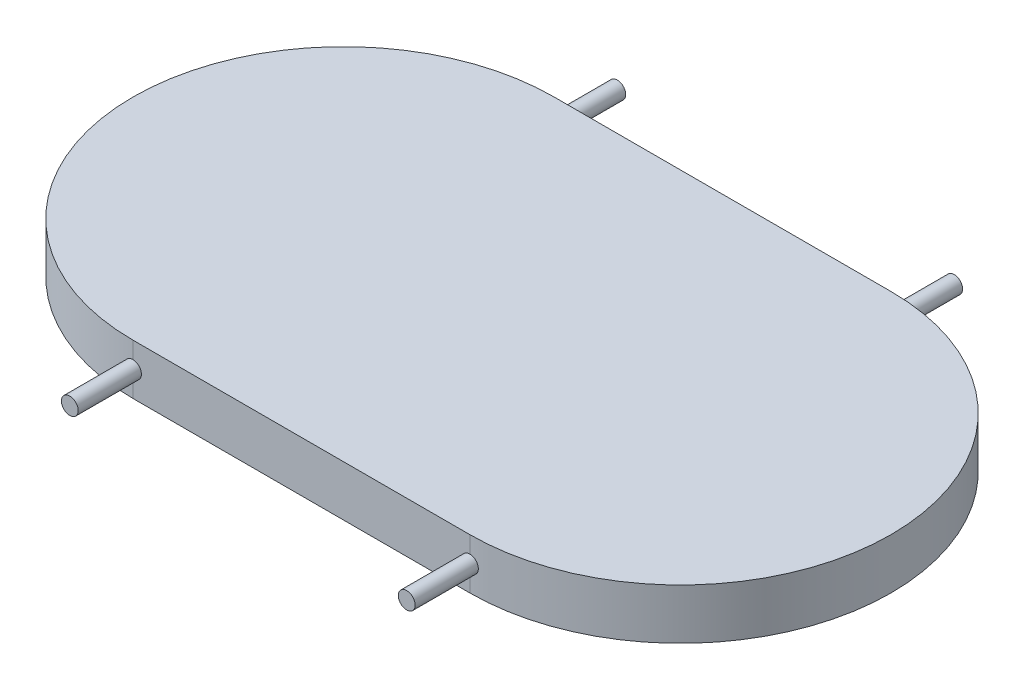
ISO-10303-21;
HEADER;
FILE_DESCRIPTION(('STEP AP214'),'2;1');
FILE_NAME('part.step','',(''),(''),'','','');
FILE_SCHEMA(('AUTOMOTIVE_DESIGN { 1 0 10303 214 1 1 1 1 }'));
ENDSEC;
DATA;
#1=APPLICATION_CONTEXT('core data for automotive mechanical design processes');
#2=APPLICATION_PROTOCOL_DEFINITION('international standard','automotive_design',2000,#1);
#3=PRODUCT_CONTEXT('',#1,'mechanical');
#4=PRODUCT('Part','Part','',(#3));
#5=PRODUCT_RELATED_PRODUCT_CATEGORY('part','',(#4));
#6=PRODUCT_DEFINITION_FORMATION('','',#4);
#7=PRODUCT_DEFINITION_CONTEXT('part definition',#1,'design');
#8=PRODUCT_DEFINITION('design','',#6,#7);
#9=PRODUCT_DEFINITION_SHAPE('','',#8);
#10=(LENGTH_UNIT() NAMED_UNIT(*) SI_UNIT(.MILLI.,.METRE.));
#11=(NAMED_UNIT(*) PLANE_ANGLE_UNIT() SI_UNIT($,.RADIAN.));
#12=(NAMED_UNIT(*) SI_UNIT($,.STERADIAN.) SOLID_ANGLE_UNIT());
#13=UNCERTAINTY_MEASURE_WITH_UNIT(LENGTH_MEASURE(1.E-05),#10,'distance_accuracy_value','');
#14=(GEOMETRIC_REPRESENTATION_CONTEXT(3) GLOBAL_UNCERTAINTY_ASSIGNED_CONTEXT((#13)) GLOBAL_UNIT_ASSIGNED_CONTEXT((#10,
#11,#12)) REPRESENTATION_CONTEXT('',''));
#15=CARTESIAN_POINT('',(0.,0.,0.));
#16=DIRECTION('',(0.,0.,1.));
#17=DIRECTION('',(1.,0.,0.));
#18=AXIS2_PLACEMENT_3D('',#15,#16,#17);
#19=CARTESIAN_POINT('',(-200.,60.,0.));
#20=DIRECTION('',(0.,-1.,0.));
#21=DIRECTION('',(0.,0.,-1.));
#22=AXIS2_PLACEMENT_3D('',#19,#20,#21);
#23=CYLINDRICAL_SURFACE('',#22,250.);
#24=CARTESIAN_POINT('',(-200.,0.,0.));
#25=DIRECTION('',(0.,1.,0.));
#26=DIRECTION('',(0.,0.,1.));
#27=AXIS2_PLACEMENT_3D('',#24,#25,#26);
#28=CIRCLE('',#27,250.);
#29=CARTESIAN_POINT('',(-200.,0.,-250.));
#30=VERTEX_POINT('',#29);
#31=CARTESIAN_POINT('',(-200.,0.,250.));
#32=VERTEX_POINT('',#31);
#33=EDGE_CURVE('E158',#30,#32,#28,.T.);
#34=ORIENTED_EDGE('',*,*,#33,.T.);
#35=DIRECTION('',(0.,-1.,0.));
#36=VECTOR('',#35,1.);
#37=CARTESIAN_POINT('',(-200.,60.,250.));
#38=LINE('',#37,#36);
#39=CARTESIAN_POINT('',(-200.,20.,250.));
#40=VERTEX_POINT('',#39);
#41=EDGE_CURVE('E197',#40,#32,#38,.T.);
#42=ORIENTED_EDGE('',*,*,#41,.F.);
#43=CARTESIAN_POINT('',(-200.,40.,250.));
#44=VERTEX_POINT('',#43);
#45=EDGE_CURVE('E201',#44,#40,#38,.T.);
#46=ORIENTED_EDGE('',*,*,#45,.F.);
#47=CARTESIAN_POINT('',(-200.,60.,250.));
#48=VERTEX_POINT('',#47);
#49=EDGE_CURVE('E199',#48,#44,#38,.T.);
#50=ORIENTED_EDGE('',*,*,#49,.F.);
#51=CARTESIAN_POINT('',(-200.,60.,0.));
#52=DIRECTION('',(0.,1.,0.));
#53=DIRECTION('',(0.,0.,1.));
#54=AXIS2_PLACEMENT_3D('',#51,#52,#53);
#55=CIRCLE('',#54,250.);
#56=CARTESIAN_POINT('',(-200.,60.,-250.));
#57=VERTEX_POINT('',#56);
#58=EDGE_CURVE('E162',#57,#48,#55,.T.);
#59=ORIENTED_EDGE('',*,*,#58,.F.);
#60=DIRECTION('',(0.,-1.,0.));
#61=VECTOR('',#60,1.);
#62=CARTESIAN_POINT('',(-200.,60.,-250.));
#63=LINE('',#62,#61);
#64=CARTESIAN_POINT('',(-200.,40.,-250.));
#65=VERTEX_POINT('',#64);
#66=EDGE_CURVE('E113',#57,#65,#63,.T.);
#67=ORIENTED_EDGE('',*,*,#66,.T.);
#68=CARTESIAN_POINT('',(-200.,20.,-250.));
#69=VERTEX_POINT('',#68);
#70=EDGE_CURVE('E108',#65,#69,#63,.T.);
#71=ORIENTED_EDGE('',*,*,#70,.T.);
#72=EDGE_CURVE('E110',#69,#30,#63,.T.);
#73=ORIENTED_EDGE('',*,*,#72,.T.);
#74=EDGE_LOOP('',(#34,#42,#46,#50,#59,#67,#71,#73));
#75=FACE_BOUND('',#74,.T.);
#76=ADVANCED_FACE('F45',(#75),#23,.T.);
#77=CARTESIAN_POINT('',(-200.,60.,250.));
#78=DIRECTION('',(0.,0.,-1.));
#79=DIRECTION('',(-1.,0.,0.));
#80=AXIS2_PLACEMENT_3D('',#77,#78,#79);
#81=PLANE('',#80);
#82=CARTESIAN_POINT('',(200.,30.,250.));
#83=DIRECTION('',(0.,0.,1.));
#84=DIRECTION('',(1.,0.,0.));
#85=AXIS2_PLACEMENT_3D('',#82,#83,#84);
#86=CIRCLE('',#85,10.);
#87=CARTESIAN_POINT('',(200.,40.,250.));
#88=VERTEX_POINT('',#87);
#89=CARTESIAN_POINT('',(200.,20.,250.));
#90=VERTEX_POINT('',#89);
#91=EDGE_CURVE('E146',#88,#90,#86,.T.);
#92=ORIENTED_EDGE('',*,*,#91,.F.);
#93=DIRECTION('',(0.,-1.,0.));
#94=VECTOR('',#93,1.);
#95=CARTESIAN_POINT('',(200.,60.,250.));
#96=LINE('',#95,#94);
#97=CARTESIAN_POINT('',(200.,60.,250.));
#98=VERTEX_POINT('',#97);
#99=EDGE_CURVE('E193',#98,#88,#96,.T.);
#100=ORIENTED_EDGE('',*,*,#99,.F.);
#101=DIRECTION('',(1.,0.,0.));
#102=VECTOR('',#101,1.);
#103=CARTESIAN_POINT('',(-200.,60.,250.));
#104=LINE('',#103,#102);
#105=EDGE_CURVE('E166',#48,#98,#104,.T.);
#106=ORIENTED_EDGE('',*,*,#105,.F.);
#107=ORIENTED_EDGE('',*,*,#49,.T.);
#108=CARTESIAN_POINT('',(-200.,30.,250.));
#109=DIRECTION('',(0.,0.,-1.));
#110=DIRECTION('',(-1.,0.,0.));
#111=AXIS2_PLACEMENT_3D('',#108,#109,#110);
#112=CIRCLE('',#111,10.);
#113=EDGE_CURVE('E53',#40,#44,#112,.F.);
#114=ORIENTED_EDGE('',*,*,#113,.F.);
#115=ORIENTED_EDGE('',*,*,#41,.T.);
#116=DIRECTION('',(1.,0.,0.));
#117=VECTOR('',#116,1.);
#118=CARTESIAN_POINT('',(-200.,0.,250.));
#119=LINE('',#118,#117);
#120=CARTESIAN_POINT('',(200.,0.,250.));
#121=VERTEX_POINT('',#120);
#122=EDGE_CURVE('E176',#32,#121,#119,.T.);
#123=ORIENTED_EDGE('',*,*,#122,.T.);
#124=EDGE_CURVE('E191',#90,#121,#96,.T.);
#125=ORIENTED_EDGE('',*,*,#124,.F.);
#126=EDGE_LOOP('',(#92,#100,#106,#107,#114,#115,#123,#125));
#127=FACE_BOUND('',#126,.T.);
#128=ADVANCED_FACE('F218',(#127),#81,.F.);
#129=CARTESIAN_POINT('',(200.,60.,0.));
#130=DIRECTION('',(0.,-1.,0.));
#131=DIRECTION('',(0.,0.,-1.));
#132=AXIS2_PLACEMENT_3D('',#129,#130,#131);
#133=CYLINDRICAL_SURFACE('',#132,250.);
#134=CARTESIAN_POINT('',(200.,0.,0.));
#135=DIRECTION('',(0.,1.,0.));
#136=DIRECTION('',(0.,0.,1.));
#137=AXIS2_PLACEMENT_3D('',#134,#135,#136);
#138=CIRCLE('',#137,250.);
#139=CARTESIAN_POINT('',(200.,0.,-250.));
#140=VERTEX_POINT('',#139);
#141=EDGE_CURVE('E180',#121,#140,#138,.T.);
#142=ORIENTED_EDGE('',*,*,#141,.T.);
#143=DIRECTION('',(0.,-1.,0.));
#144=VECTOR('',#143,1.);
#145=CARTESIAN_POINT('',(200.,60.,-250.));
#146=LINE('',#145,#144);
#147=CARTESIAN_POINT('',(200.,20.,-250.));
#148=VERTEX_POINT('',#147);
#149=EDGE_CURVE('E187',#148,#140,#146,.T.);
#150=ORIENTED_EDGE('',*,*,#149,.F.);
#151=CARTESIAN_POINT('',(200.,40.,-250.));
#152=VERTEX_POINT('',#151);
#153=EDGE_CURVE('E192',#152,#148,#146,.T.);
#154=ORIENTED_EDGE('',*,*,#153,.F.);
#155=CARTESIAN_POINT('',(200.,60.,-250.));
#156=VERTEX_POINT('',#155);
#157=EDGE_CURVE('E188',#156,#152,#146,.T.);
#158=ORIENTED_EDGE('',*,*,#157,.F.);
#159=CARTESIAN_POINT('',(200.,60.,0.));
#160=DIRECTION('',(0.,1.,0.));
#161=DIRECTION('',(0.,0.,1.));
#162=AXIS2_PLACEMENT_3D('',#159,#160,#161);
#163=CIRCLE('',#162,250.);
#164=EDGE_CURVE('E169',#98,#156,#163,.T.);
#165=ORIENTED_EDGE('',*,*,#164,.F.);
#166=ORIENTED_EDGE('',*,*,#99,.T.);
#167=EDGE_CURVE('E198',#88,#90,#96,.T.);
#168=ORIENTED_EDGE('',*,*,#167,.T.);
#169=ORIENTED_EDGE('',*,*,#124,.T.);
#170=EDGE_LOOP('',(#142,#150,#154,#158,#165,#166,#168,#169));
#171=FACE_BOUND('',#170,.T.);
#172=ADVANCED_FACE('F224',(#171),#133,.T.);
#173=CARTESIAN_POINT('',(-200.,60.,-250.));
#174=DIRECTION('',(0.,0.,1.));
#175=DIRECTION('',(1.,0.,0.));
#176=AXIS2_PLACEMENT_3D('',#173,#174,#175);
#177=PLANE('',#176);
#178=CARTESIAN_POINT('',(-200.,30.,-250.));
#179=DIRECTION('',(0.,0.,-1.));
#180=DIRECTION('',(-1.,0.,0.));
#181=AXIS2_PLACEMENT_3D('',#178,#179,#180);
#182=CIRCLE('',#181,10.);
#183=EDGE_CURVE('E60',#65,#69,#182,.T.);
#184=ORIENTED_EDGE('',*,*,#183,.F.);
#185=ORIENTED_EDGE('',*,*,#66,.F.);
#186=DIRECTION('',(-1.,0.,0.));
#187=VECTOR('',#186,1.);
#188=CARTESIAN_POINT('',(-200.,60.,-250.));
#189=LINE('',#188,#187);
#190=EDGE_CURVE('E124',#156,#57,#189,.T.);
#191=ORIENTED_EDGE('',*,*,#190,.F.);
#192=ORIENTED_EDGE('',*,*,#157,.T.);
#193=CARTESIAN_POINT('',(200.,30.,-250.));
#194=DIRECTION('',(0.,0.,1.));
#195=DIRECTION('',(1.,0.,0.));
#196=AXIS2_PLACEMENT_3D('',#193,#194,#195);
#197=CIRCLE('',#196,10.);
#198=EDGE_CURVE('E11',#148,#152,#197,.F.);
#199=ORIENTED_EDGE('',*,*,#198,.F.);
#200=ORIENTED_EDGE('',*,*,#149,.T.);
#201=DIRECTION('',(-1.,0.,0.));
#202=VECTOR('',#201,1.);
#203=CARTESIAN_POINT('',(-200.,0.,-250.));
#204=LINE('',#203,#202);
#205=EDGE_CURVE('E121',#140,#30,#204,.T.);
#206=ORIENTED_EDGE('',*,*,#205,.T.);
#207=ORIENTED_EDGE('',*,*,#72,.F.);
#208=EDGE_LOOP('',(#184,#185,#191,#192,#199,#200,#206,#207));
#209=FACE_BOUND('',#208,.T.);
#210=ADVANCED_FACE('F119',(#209),#177,.F.);
#211=CARTESIAN_POINT('',(-200.,60.,0.));
#212=DIRECTION('',(0.,1.,0.));
#213=DIRECTION('',(0.,0.,1.));
#214=AXIS2_PLACEMENT_3D('',#211,#212,#213);
#215=PLANE('',#214);
#216=ORIENTED_EDGE('',*,*,#58,.T.);
#217=ORIENTED_EDGE('',*,*,#105,.T.);
#218=ORIENTED_EDGE('',*,*,#164,.T.);
#219=ORIENTED_EDGE('',*,*,#190,.T.);
#220=EDGE_LOOP('',(#216,#217,#218,#219));
#221=FACE_BOUND('',#220,.T.);
#222=ADVANCED_FACE('F243',(#221),#215,.T.);
#223=CARTESIAN_POINT('',(-200.,0.,0.));
#224=DIRECTION('',(0.,1.,0.));
#225=DIRECTION('',(0.,0.,1.));
#226=AXIS2_PLACEMENT_3D('',#223,#224,#225);
#227=PLANE('',#226);
#228=ORIENTED_EDGE('',*,*,#33,.F.);
#229=ORIENTED_EDGE('',*,*,#205,.F.);
#230=ORIENTED_EDGE('',*,*,#141,.F.);
#231=ORIENTED_EDGE('',*,*,#122,.F.);
#232=EDGE_LOOP('',(#228,#229,#230,#231));
#233=FACE_BOUND('',#232,.T.);
#234=ADVANCED_FACE('F222',(#233),#227,.F.);
#235=CARTESIAN_POINT('',(-200.,30.,250.));
#236=DIRECTION('',(0.,0.,1.));
#237=DIRECTION('',(1.,0.,0.));
#238=AXIS2_PLACEMENT_3D('',#235,#236,#237);
#239=PLANE('',#238);
#240=CARTESIAN_POINT('',(-200.,30.,250.));
#241=DIRECTION('',(0.,0.,1.));
#242=DIRECTION('',(1.,0.,0.));
#243=AXIS2_PLACEMENT_3D('',#240,#241,#242);
#244=CIRCLE('',#243,10.);
#245=EDGE_CURVE('E149',#44,#40,#244,.T.);
#246=ORIENTED_EDGE('',*,*,#245,.F.);
#247=ORIENTED_EDGE('',*,*,#45,.T.);
#248=EDGE_LOOP('',(#246,#247));
#249=FACE_BOUND('',#248,.T.);
#250=ADVANCED_FACE('F211',(#249),#239,.F.);
#251=CARTESIAN_POINT('',(-200.,30.,325.));
#252=DIRECTION('',(0.,0.,-1.));
#253=DIRECTION('',(-1.,0.,0.));
#254=AXIS2_PLACEMENT_3D('',#251,#252,#253);
#255=CYLINDRICAL_SURFACE('',#254,10.);
#256=CARTESIAN_POINT('',(-200.,30.,325.));
#257=DIRECTION('',(0.,0.,1.));
#258=DIRECTION('',(1.,0.,0.));
#259=AXIS2_PLACEMENT_3D('',#256,#257,#258);
#260=CIRCLE('',#259,10.);
#261=CARTESIAN_POINT('',(-190.,30.,325.));
#262=VERTEX_POINT('',#261);
#263=EDGE_CURVE('E154',#262,#262,#260,.T.);
#264=ORIENTED_EDGE('',*,*,#263,.F.);
#265=EDGE_LOOP('',(#264));
#266=FACE_BOUND('',#265,.T.);
#267=ORIENTED_EDGE('',*,*,#245,.T.);
#268=ORIENTED_EDGE('',*,*,#113,.T.);
#269=EDGE_LOOP('',(#267,#268));
#270=FACE_BOUND('',#269,.T.);
#271=ADVANCED_FACE('F206',(#266,#270),#255,.T.);
#272=CARTESIAN_POINT('',(-200.,30.,325.));
#273=DIRECTION('',(0.,0.,1.));
#274=DIRECTION('',(1.,0.,0.));
#275=AXIS2_PLACEMENT_3D('',#272,#273,#274);
#276=PLANE('',#275);
#277=ORIENTED_EDGE('',*,*,#263,.T.);
#278=EDGE_LOOP('',(#277));
#279=FACE_BOUND('',#278,.T.);
#280=ADVANCED_FACE('F279',(#279),#276,.T.);
#281=CARTESIAN_POINT('',(200.,30.,325.));
#282=DIRECTION('',(0.,0.,-1.));
#283=DIRECTION('',(-1.,0.,0.));
#284=AXIS2_PLACEMENT_3D('',#281,#282,#283);
#285=CYLINDRICAL_SURFACE('',#284,10.);
#286=CARTESIAN_POINT('',(200.,30.,325.));
#287=DIRECTION('',(0.,0.,1.));
#288=DIRECTION('',(1.,0.,0.));
#289=AXIS2_PLACEMENT_3D('',#286,#287,#288);
#290=CIRCLE('',#289,10.);
#291=CARTESIAN_POINT('',(210.,30.,325.));
#292=VERTEX_POINT('',#291);
#293=EDGE_CURVE('E144',#292,#292,#290,.T.);
#294=ORIENTED_EDGE('',*,*,#293,.F.);
#295=EDGE_LOOP('',(#294));
#296=FACE_BOUND('',#295,.T.);
#297=ORIENTED_EDGE('',*,*,#91,.T.);
#298=EDGE_CURVE('E150',#90,#88,#86,.T.);
#299=ORIENTED_EDGE('',*,*,#298,.T.);
#300=EDGE_LOOP('',(#297,#299));
#301=FACE_BOUND('',#300,.T.);
#302=ADVANCED_FACE('F236',(#296,#301),#285,.T.);
#303=CARTESIAN_POINT('',(200.,30.,325.));
#304=DIRECTION('',(0.,0.,1.));
#305=DIRECTION('',(1.,0.,0.));
#306=AXIS2_PLACEMENT_3D('',#303,#304,#305);
#307=PLANE('',#306);
#308=ORIENTED_EDGE('',*,*,#293,.T.);
#309=EDGE_LOOP('',(#308));
#310=FACE_BOUND('',#309,.T.);
#311=ADVANCED_FACE('F259',(#310),#307,.T.);
#312=CARTESIAN_POINT('',(200.,30.,250.));
#313=DIRECTION('',(0.,0.,1.));
#314=DIRECTION('',(1.,0.,0.));
#315=AXIS2_PLACEMENT_3D('',#312,#313,#314);
#316=PLANE('',#315);
#317=ORIENTED_EDGE('',*,*,#167,.F.);
#318=ORIENTED_EDGE('',*,*,#298,.F.);
#319=EDGE_LOOP('',(#317,#318));
#320=FACE_BOUND('',#319,.T.);
#321=ADVANCED_FACE('F250',(#320),#316,.F.);
#322=CARTESIAN_POINT('',(200.,30.,-250.));
#323=DIRECTION('',(0.,0.,-1.));
#324=DIRECTION('',(-1.,0.,0.));
#325=AXIS2_PLACEMENT_3D('',#322,#323,#324);
#326=PLANE('',#325);
#327=CARTESIAN_POINT('',(200.,30.,-250.));
#328=DIRECTION('',(0.,0.,-1.));
#329=DIRECTION('',(-1.,0.,0.));
#330=AXIS2_PLACEMENT_3D('',#327,#328,#329);
#331=CIRCLE('',#330,10.);
#332=EDGE_CURVE('E133',#152,#148,#331,.T.);
#333=ORIENTED_EDGE('',*,*,#332,.F.);
#334=ORIENTED_EDGE('',*,*,#153,.T.);
#335=EDGE_LOOP('',(#333,#334));
#336=FACE_BOUND('',#335,.T.);
#337=ADVANCED_FACE('F248',(#336),#326,.F.);
#338=CARTESIAN_POINT('',(200.,30.,-325.));
#339=DIRECTION('',(0.,0.,1.));
#340=DIRECTION('',(1.,0.,0.));
#341=AXIS2_PLACEMENT_3D('',#338,#339,#340);
#342=CYLINDRICAL_SURFACE('',#341,10.);
#343=CARTESIAN_POINT('',(200.,30.,-325.));
#344=DIRECTION('',(0.,0.,-1.));
#345=DIRECTION('',(-1.,0.,0.));
#346=AXIS2_PLACEMENT_3D('',#343,#344,#345);
#347=CIRCLE('',#346,10.);
#348=CARTESIAN_POINT('',(190.,30.,-325.));
#349=VERTEX_POINT('',#348);
#350=EDGE_CURVE('E136',#349,#349,#347,.T.);
#351=ORIENTED_EDGE('',*,*,#350,.F.);
#352=EDGE_LOOP('',(#351));
#353=FACE_BOUND('',#352,.T.);
#354=ORIENTED_EDGE('',*,*,#332,.T.);
#355=ORIENTED_EDGE('',*,*,#198,.T.);
#356=EDGE_LOOP('',(#354,#355));
#357=FACE_BOUND('',#356,.T.);
#358=ADVANCED_FACE('F247',(#353,#357),#342,.T.);
#359=CARTESIAN_POINT('',(200.,30.,-325.));
#360=DIRECTION('',(0.,0.,-1.));
#361=DIRECTION('',(-1.,0.,0.));
#362=AXIS2_PLACEMENT_3D('',#359,#360,#361);
#363=PLANE('',#362);
#364=ORIENTED_EDGE('',*,*,#350,.T.);
#365=EDGE_LOOP('',(#364));
#366=FACE_BOUND('',#365,.T.);
#367=ADVANCED_FACE('F256',(#366),#363,.T.);
#368=CARTESIAN_POINT('',(-200.,30.,-325.));
#369=DIRECTION('',(0.,0.,1.));
#370=DIRECTION('',(1.,0.,0.));
#371=AXIS2_PLACEMENT_3D('',#368,#369,#370);
#372=CYLINDRICAL_SURFACE('',#371,10.);
#373=CARTESIAN_POINT('',(-200.,30.,-325.));
#374=DIRECTION('',(0.,0.,-1.));
#375=DIRECTION('',(-1.,0.,0.));
#376=AXIS2_PLACEMENT_3D('',#373,#374,#375);
#377=CIRCLE('',#376,10.);
#378=CARTESIAN_POINT('',(-210.,30.,-325.));
#379=VERTEX_POINT('',#378);
#380=EDGE_CURVE('E129',#379,#379,#377,.T.);
#381=ORIENTED_EDGE('',*,*,#380,.F.);
#382=EDGE_LOOP('',(#381));
#383=FACE_BOUND('',#382,.T.);
#384=ORIENTED_EDGE('',*,*,#183,.T.);
#385=EDGE_CURVE('E125',#69,#65,#182,.T.);
#386=ORIENTED_EDGE('',*,*,#385,.T.);
#387=EDGE_LOOP('',(#384,#386));
#388=FACE_BOUND('',#387,.T.);
#389=ADVANCED_FACE('F131',(#383,#388),#372,.T.);
#390=CARTESIAN_POINT('',(-200.,30.,-325.));
#391=DIRECTION('',(0.,0.,-1.));
#392=DIRECTION('',(-1.,0.,0.));
#393=AXIS2_PLACEMENT_3D('',#390,#391,#392);
#394=PLANE('',#393);
#395=ORIENTED_EDGE('',*,*,#380,.T.);
#396=EDGE_LOOP('',(#395));
#397=FACE_BOUND('',#396,.T.);
#398=ADVANCED_FACE('F333',(#397),#394,.T.);
#399=CARTESIAN_POINT('',(-200.,30.,-250.));
#400=DIRECTION('',(0.,0.,-1.));
#401=DIRECTION('',(-1.,0.,0.));
#402=AXIS2_PLACEMENT_3D('',#399,#400,#401);
#403=PLANE('',#402);
#404=ORIENTED_EDGE('',*,*,#70,.F.);
#405=ORIENTED_EDGE('',*,*,#385,.F.);
#406=EDGE_LOOP('',(#404,#405));
#407=FACE_BOUND('',#406,.T.);
#408=ADVANCED_FACE('F126',(#407),#403,.F.);
#409=CLOSED_SHELL('',(#76,#128,#172,#210,#222,#234,#250,#271,#280,#302,#311,#321,#337,#358,#367,
#389,#398,#408));
#410=MANIFOLD_SOLID_BREP('B2',#409);
#411=ADVANCED_BREP_SHAPE_REPRESENTATION('',(#18,#410),#14);
#412=SHAPE_DEFINITION_REPRESENTATION(#9,#411);
ENDSEC;
END-ISO-10303-21;
